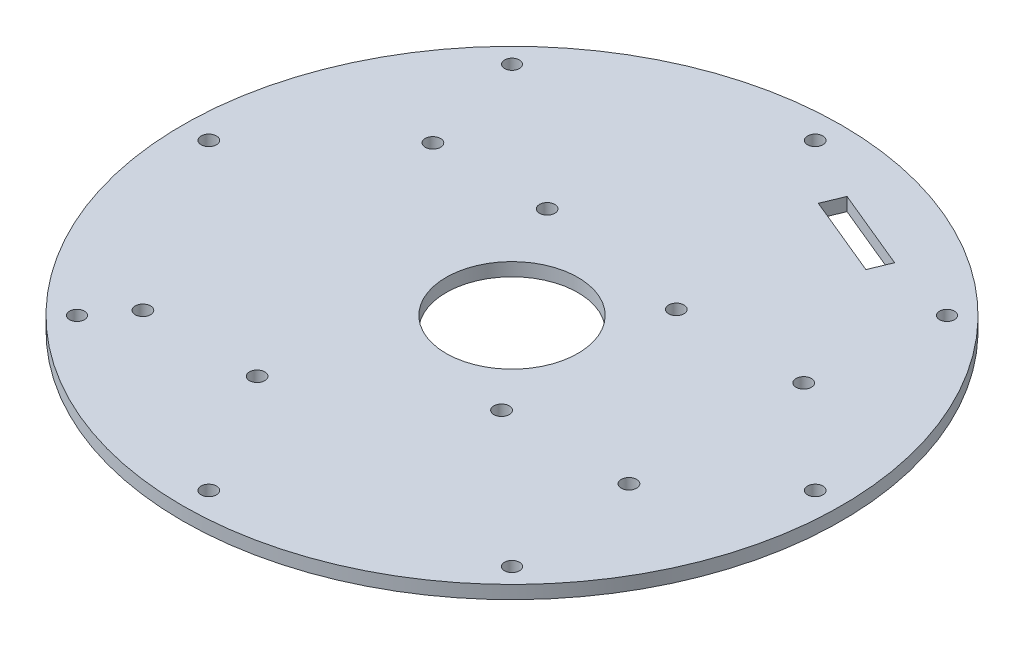
ISO-10303-21;
HEADER;
FILE_DESCRIPTION(('STEP AP214'),'2;1');
FILE_NAME('part.step','',(''),(''),'','','');
FILE_SCHEMA(('AUTOMOTIVE_DESIGN { 1 0 10303 214 1 1 1 1 }'));
ENDSEC;
DATA;
#1=APPLICATION_CONTEXT('core data for automotive mechanical design processes');
#2=APPLICATION_PROTOCOL_DEFINITION('international standard','automotive_design',2000,#1);
#3=PRODUCT_CONTEXT('',#1,'mechanical');
#4=PRODUCT('Part','Part','',(#3));
#5=PRODUCT_RELATED_PRODUCT_CATEGORY('part','',(#4));
#6=PRODUCT_DEFINITION_FORMATION('','',#4);
#7=PRODUCT_DEFINITION_CONTEXT('part definition',#1,'design');
#8=PRODUCT_DEFINITION('design','',#6,#7);
#9=PRODUCT_DEFINITION_SHAPE('','',#8);
#10=(LENGTH_UNIT() NAMED_UNIT(*) SI_UNIT(.MILLI.,.METRE.));
#11=(NAMED_UNIT(*) PLANE_ANGLE_UNIT() SI_UNIT($,.RADIAN.));
#12=(NAMED_UNIT(*) SI_UNIT($,.STERADIAN.) SOLID_ANGLE_UNIT());
#13=UNCERTAINTY_MEASURE_WITH_UNIT(LENGTH_MEASURE(1.E-05),#10,'distance_accuracy_value','');
#14=(GEOMETRIC_REPRESENTATION_CONTEXT(3) GLOBAL_UNCERTAINTY_ASSIGNED_CONTEXT((#13)) GLOBAL_UNIT_ASSIGNED_CONTEXT((#10,
#11,#12)) REPRESENTATION_CONTEXT('',''));
#15=CARTESIAN_POINT('',(0.,0.,0.));
#16=DIRECTION('',(0.,0.,1.));
#17=DIRECTION('',(1.,0.,0.));
#18=AXIS2_PLACEMENT_3D('',#15,#16,#17);
#19=CARTESIAN_POINT('',(0.,3.,0.));
#20=DIRECTION('',(0.,1.,0.));
#21=DIRECTION('',(0.,0.,1.));
#22=AXIS2_PLACEMENT_3D('',#19,#20,#21);
#23=PLANE('',#22);
#24=CARTESIAN_POINT('',(46.4944426533332,3.,19.8841311409812));
#25=DIRECTION('',(0.,1.,0.));
#26=DIRECTION('',(0.,0.,1.));
#27=AXIS2_PLACEMENT_3D('',#24,#25,#26);
#28=CIRCLE('',#27,1.75);
#29=CARTESIAN_POINT('',(46.4944426533332,3.,21.6341311409812));
#30=VERTEX_POINT('',#29);
#31=EDGE_CURVE('E134',#30,#30,#28,.T.);
#32=ORIENTED_EDGE('',*,*,#31,.F.);
#33=EDGE_LOOP('',(#32));
#34=FACE_BOUND('',#33,.T.);
#35=CARTESIAN_POINT('',(-43.,3.,41.));
#36=DIRECTION('',(0.,1.,0.));
#37=DIRECTION('',(0.,0.,1.));
#38=AXIS2_PLACEMENT_3D('',#35,#36,#37);
#39=CIRCLE('',#38,1.75);
#40=CARTESIAN_POINT('',(-43.,3.,42.75));
#41=VERTEX_POINT('',#40);
#42=EDGE_CURVE('E127',#41,#41,#39,.T.);
#43=ORIENTED_EDGE('',*,*,#42,.F.);
#44=EDGE_LOOP('',(#43));
#45=FACE_BOUND('',#44,.T.);
#46=CARTESIAN_POINT('',(-17.,3.,41.));
#47=DIRECTION('',(0.,1.,0.));
#48=DIRECTION('',(0.,0.,1.));
#49=AXIS2_PLACEMENT_3D('',#46,#47,#48);
#50=CIRCLE('',#49,1.75);
#51=CARTESIAN_POINT('',(-17.,3.,42.75));
#52=VERTEX_POINT('',#51);
#53=EDGE_CURVE('E146',#52,#52,#50,.T.);
#54=ORIENTED_EDGE('',*,*,#53,.F.);
#55=EDGE_LOOP('',(#54));
#56=FACE_BOUND('',#55,.T.);
#57=CARTESIAN_POINT('',(-17.,3.,-25.));
#58=DIRECTION('',(0.,1.,0.));
#59=DIRECTION('',(0.,0.,1.));
#60=AXIS2_PLACEMENT_3D('',#57,#58,#59);
#61=CIRCLE('',#60,1.75);
#62=CARTESIAN_POINT('',(-17.,3.,-23.25));
#63=VERTEX_POINT('',#62);
#64=EDGE_CURVE('E139',#63,#63,#61,.T.);
#65=ORIENTED_EDGE('',*,*,#64,.F.);
#66=EDGE_LOOP('',(#65));
#67=FACE_BOUND('',#66,.T.);
#68=DIRECTION('',(-0.923879532511288,0.,-0.382683432365086));
#69=VECTOR('',#68,1.);
#70=CARTESIAN_POINT('',(33.1565098479308,3.,-53.9156364583046));
#71=LINE('',#70,#69);
#72=CARTESIAN_POINT('',(33.1565098479308,3.,-53.9156364583046));
#73=VERTEX_POINT('',#72);
#74=CARTESIAN_POINT('',(14.678919197705,3.,-61.5693051056064));
#75=VERTEX_POINT('',#74);
#76=EDGE_CURVE('E83',#73,#75,#71,.T.);
#77=ORIENTED_EDGE('',*,*,#76,.F.);
#78=DIRECTION('',(0.382683432365087,0.,-0.923879532511288));
#79=VECTOR('',#78,1.);
#80=CARTESIAN_POINT('',(31.2430926861054,3.,-49.2962387957482));
#81=LINE('',#80,#79);
#82=CARTESIAN_POINT('',(31.2430926861054,3.,-49.2962387957482));
#83=VERTEX_POINT('',#82);
#84=EDGE_CURVE('E75',#83,#73,#81,.T.);
#85=ORIENTED_EDGE('',*,*,#84,.F.);
#86=DIRECTION('',(0.923879532511288,0.,0.382683432365086));
#87=VECTOR('',#86,1.);
#88=CARTESIAN_POINT('',(31.2430926861054,3.,-49.2962387957482));
#89=LINE('',#88,#87);
#90=CARTESIAN_POINT('',(12.7655020358796,3.,-56.9499074430499));
#91=VERTEX_POINT('',#90);
#92=EDGE_CURVE('E98',#91,#83,#89,.T.);
#93=ORIENTED_EDGE('',*,*,#92,.F.);
#94=DIRECTION('',(-0.382683432365086,0.,0.923879532511288));
#95=VECTOR('',#94,1.);
#96=CARTESIAN_POINT('',(12.7655020358796,3.,-56.9499074430499));
#97=LINE('',#96,#95);
#98=EDGE_CURVE('E96',#75,#91,#97,.T.);
#99=ORIENTED_EDGE('',*,*,#98,.F.);
#100=EDGE_LOOP('',(#77,#85,#93,#99));
#101=FACE_BOUND('',#100,.T.);
#102=CARTESIAN_POINT('',(17.5055573466668,3.,19.8841311409812));
#103=DIRECTION('',(0.,1.,0.));
#104=DIRECTION('',(0.,0.,1.));
#105=AXIS2_PLACEMENT_3D('',#102,#103,#104);
#106=CIRCLE('',#105,1.75);
#107=CARTESIAN_POINT('',(17.5055573466668,3.,21.6341311409812));
#108=VERTEX_POINT('',#107);
#109=EDGE_CURVE('E126',#108,#108,#106,.T.);
#110=ORIENTED_EDGE('',*,*,#109,.F.);
#111=EDGE_LOOP('',(#110));
#112=FACE_BOUND('',#111,.T.);
#113=CARTESIAN_POINT('',(46.4944426533332,3.,-19.8841311409812));
#114=DIRECTION('',(0.,1.,0.));
#115=DIRECTION('',(0.,0.,1.));
#116=AXIS2_PLACEMENT_3D('',#113,#114,#115);
#117=CIRCLE('',#116,1.75);
#118=CARTESIAN_POINT('',(46.4944426533332,3.,-18.1341311409812));
#119=VERTEX_POINT('',#118);
#120=EDGE_CURVE('E120',#119,#119,#117,.T.);
#121=ORIENTED_EDGE('',*,*,#120,.F.);
#122=EDGE_LOOP('',(#121));
#123=FACE_BOUND('',#122,.T.);
#124=CARTESIAN_POINT('',(17.5055573466668,3.,-19.8841311409812));
#125=DIRECTION('',(0.,1.,0.));
#126=DIRECTION('',(0.,0.,1.));
#127=AXIS2_PLACEMENT_3D('',#124,#125,#126);
#128=CIRCLE('',#127,1.74999999999999);
#129=CARTESIAN_POINT('',(17.5055573466668,3.,-18.1341311409812));
#130=VERTEX_POINT('',#129);
#131=EDGE_CURVE('E113',#130,#130,#128,.T.);
#132=ORIENTED_EDGE('',*,*,#131,.F.);
#133=EDGE_LOOP('',(#132));
#134=FACE_BOUND('',#133,.T.);
#135=CARTESIAN_POINT('',(-43.,3.,-25.));
#136=DIRECTION('',(0.,1.,0.));
#137=DIRECTION('',(0.,0.,1.));
#138=AXIS2_PLACEMENT_3D('',#135,#136,#137);
#139=CIRCLE('',#138,1.75);
#140=CARTESIAN_POINT('',(-43.,3.,-23.25));
#141=VERTEX_POINT('',#140);
#142=EDGE_CURVE('E151',#141,#141,#139,.T.);
#143=ORIENTED_EDGE('',*,*,#142,.F.);
#144=EDGE_LOOP('',(#143));
#145=FACE_BOUND('',#144,.T.);
#146=CARTESIAN_POINT('',(0.,3.,-69.));
#147=DIRECTION('',(0.,1.,0.));
#148=DIRECTION('',(0.,0.,1.));
#149=AXIS2_PLACEMENT_3D('',#146,#147,#148);
#150=CIRCLE('',#149,1.75);
#151=CARTESIAN_POINT('',(0.,3.,-67.25));
#152=VERTEX_POINT('',#151);
#153=EDGE_CURVE('E157',#152,#152,#150,.T.);
#154=ORIENTED_EDGE('',*,*,#153,.F.);
#155=EDGE_LOOP('',(#154));
#156=FACE_BOUND('',#155,.T.);
#157=CARTESIAN_POINT('',(69.,3.,0.));
#158=DIRECTION('',(0.,1.,0.));
#159=DIRECTION('',(0.,0.,1.));
#160=AXIS2_PLACEMENT_3D('',#157,#158,#159);
#161=CIRCLE('',#160,1.75);
#162=CARTESIAN_POINT('',(69.,3.,1.75));
#163=VERTEX_POINT('',#162);
#164=EDGE_CURVE('E164',#163,#163,#161,.T.);
#165=ORIENTED_EDGE('',*,*,#164,.F.);
#166=EDGE_LOOP('',(#165));
#167=FACE_BOUND('',#166,.T.);
#168=CARTESIAN_POINT('',(0.,3.,69.));
#169=DIRECTION('',(0.,1.,0.));
#170=DIRECTION('',(0.,0.,1.));
#171=AXIS2_PLACEMENT_3D('',#168,#169,#170);
#172=CIRCLE('',#171,1.75);
#173=CARTESIAN_POINT('',(0.,3.,70.75));
#174=VERTEX_POINT('',#173);
#175=EDGE_CURVE('E170',#174,#174,#172,.T.);
#176=ORIENTED_EDGE('',*,*,#175,.F.);
#177=EDGE_LOOP('',(#176));
#178=FACE_BOUND('',#177,.T.);
#179=CARTESIAN_POINT('',(-69.,3.,0.));
#180=DIRECTION('',(0.,1.,0.));
#181=DIRECTION('',(0.,0.,1.));
#182=AXIS2_PLACEMENT_3D('',#179,#180,#181);
#183=CIRCLE('',#182,1.75);
#184=CARTESIAN_POINT('',(-69.,3.,1.75));
#185=VERTEX_POINT('',#184);
#186=EDGE_CURVE('E176',#185,#185,#183,.T.);
#187=ORIENTED_EDGE('',*,*,#186,.F.);
#188=EDGE_LOOP('',(#187));
#189=FACE_BOUND('',#188,.T.);
#190=CARTESIAN_POINT('',(49.4974746830584,3.,49.4974746830582));
#191=DIRECTION('',(0.,1.,0.));
#192=DIRECTION('',(0.,0.,1.));
#193=AXIS2_PLACEMENT_3D('',#190,#191,#192);
#194=CIRCLE('',#193,1.7);
#195=CARTESIAN_POINT('',(49.4974746830584,3.,51.1974746830582));
#196=VERTEX_POINT('',#195);
#197=EDGE_CURVE('E187',#196,#196,#194,.T.);
#198=ORIENTED_EDGE('',*,*,#197,.F.);
#199=EDGE_LOOP('',(#198));
#200=FACE_BOUND('',#199,.T.);
#201=CARTESIAN_POINT('',(-49.4974746830584,3.,-49.4974746830582));
#202=DIRECTION('',(0.,1.,0.));
#203=DIRECTION('',(0.,0.,1.));
#204=AXIS2_PLACEMENT_3D('',#201,#202,#203);
#205=CIRCLE('',#204,1.7);
#206=CARTESIAN_POINT('',(-49.4974746830584,3.,-47.7974746830582));
#207=VERTEX_POINT('',#206);
#208=EDGE_CURVE('E199',#207,#207,#205,.T.);
#209=ORIENTED_EDGE('',*,*,#208,.F.);
#210=EDGE_LOOP('',(#209));
#211=FACE_BOUND('',#210,.T.);
#212=CARTESIAN_POINT('',(0.,3.,0.));
#213=DIRECTION('',(0.,1.,0.));
#214=DIRECTION('',(0.,0.,1.));
#215=AXIS2_PLACEMENT_3D('',#212,#213,#214);
#216=CIRCLE('',#215,75.);
#217=CARTESIAN_POINT('',(0.,3.,75.));
#218=VERTEX_POINT('',#217);
#219=EDGE_CURVE('E11',#218,#218,#216,.T.);
#220=ORIENTED_EDGE('',*,*,#219,.T.);
#221=EDGE_LOOP('',(#220));
#222=FACE_BOUND('',#221,.T.);
#223=CARTESIAN_POINT('',(49.4974746830582,3.,-49.4974746830584));
#224=DIRECTION('',(0.,1.,0.));
#225=DIRECTION('',(0.,0.,1.));
#226=AXIS2_PLACEMENT_3D('',#223,#224,#225);
#227=CIRCLE('',#226,1.7);
#228=CARTESIAN_POINT('',(49.4974746830582,3.,-47.7974746830584));
#229=VERTEX_POINT('',#228);
#230=EDGE_CURVE('E205',#229,#229,#227,.T.);
#231=ORIENTED_EDGE('',*,*,#230,.F.);
#232=EDGE_LOOP('',(#231));
#233=FACE_BOUND('',#232,.T.);
#234=CARTESIAN_POINT('',(-49.4974746830582,3.,49.4974746830584));
#235=DIRECTION('',(0.,1.,0.));
#236=DIRECTION('',(0.,0.,1.));
#237=AXIS2_PLACEMENT_3D('',#234,#235,#236);
#238=CIRCLE('',#237,1.7);
#239=CARTESIAN_POINT('',(-49.4974746830582,3.,51.1974746830584));
#240=VERTEX_POINT('',#239);
#241=EDGE_CURVE('E193',#240,#240,#238,.T.);
#242=ORIENTED_EDGE('',*,*,#241,.F.);
#243=EDGE_LOOP('',(#242));
#244=FACE_BOUND('',#243,.T.);
#245=CARTESIAN_POINT('',(0.,3.,0.));
#246=DIRECTION('',(0.,1.,0.));
#247=DIRECTION('',(0.,0.,1.));
#248=AXIS2_PLACEMENT_3D('',#245,#246,#247);
#249=CIRCLE('',#248,15.);
#250=CARTESIAN_POINT('',(0.,3.,15.));
#251=VERTEX_POINT('',#250);
#252=EDGE_CURVE('E181',#251,#251,#249,.T.);
#253=ORIENTED_EDGE('',*,*,#252,.F.);
#254=EDGE_LOOP('',(#253));
#255=FACE_BOUND('',#254,.T.);
#256=ADVANCED_FACE('F34',(#34,#45,#56,#67,#101,#112,#123,#134,#145,#156,#167,#178,#189,#200,
#211,#222,#233,#244,#255),#23,.T.);
#257=CARTESIAN_POINT('',(0.,0.,0.));
#258=DIRECTION('',(0.,1.,0.));
#259=DIRECTION('',(0.,0.,1.));
#260=AXIS2_PLACEMENT_3D('',#257,#258,#259);
#261=PLANE('',#260);
#262=CARTESIAN_POINT('',(46.4944426533332,0.,19.8841311409812));
#263=DIRECTION('',(0.,1.,0.));
#264=DIRECTION('',(0.,0.,1.));
#265=AXIS2_PLACEMENT_3D('',#262,#263,#264);
#266=CIRCLE('',#265,1.75);
#267=CARTESIAN_POINT('',(46.4944426533332,0.,21.6341311409812));
#268=VERTEX_POINT('',#267);
#269=EDGE_CURVE('E116',#268,#268,#266,.T.);
#270=ORIENTED_EDGE('',*,*,#269,.T.);
#271=EDGE_LOOP('',(#270));
#272=FACE_BOUND('',#271,.T.);
#273=CARTESIAN_POINT('',(-43.,0.,41.));
#274=DIRECTION('',(0.,1.,0.));
#275=DIRECTION('',(0.,0.,1.));
#276=AXIS2_PLACEMENT_3D('',#273,#274,#275);
#277=CIRCLE('',#276,1.75);
#278=CARTESIAN_POINT('',(-43.,0.,42.75));
#279=VERTEX_POINT('',#278);
#280=EDGE_CURVE('E131',#279,#279,#277,.T.);
#281=ORIENTED_EDGE('',*,*,#280,.T.);
#282=EDGE_LOOP('',(#281));
#283=FACE_BOUND('',#282,.T.);
#284=CARTESIAN_POINT('',(-17.,0.,41.));
#285=DIRECTION('',(0.,1.,0.));
#286=DIRECTION('',(0.,0.,1.));
#287=AXIS2_PLACEMENT_3D('',#284,#285,#286);
#288=CIRCLE('',#287,1.75);
#289=CARTESIAN_POINT('',(-17.,0.,42.75));
#290=VERTEX_POINT('',#289);
#291=EDGE_CURVE('E130',#290,#290,#288,.T.);
#292=ORIENTED_EDGE('',*,*,#291,.T.);
#293=EDGE_LOOP('',(#292));
#294=FACE_BOUND('',#293,.T.);
#295=CARTESIAN_POINT('',(-17.,0.,-25.));
#296=DIRECTION('',(0.,1.,0.));
#297=DIRECTION('',(0.,0.,1.));
#298=AXIS2_PLACEMENT_3D('',#295,#296,#297);
#299=CIRCLE('',#298,1.75);
#300=CARTESIAN_POINT('',(-17.,0.,-23.25));
#301=VERTEX_POINT('',#300);
#302=EDGE_CURVE('E143',#301,#301,#299,.T.);
#303=ORIENTED_EDGE('',*,*,#302,.T.);
#304=EDGE_LOOP('',(#303));
#305=FACE_BOUND('',#304,.T.);
#306=DIRECTION('',(0.382683432365087,0.,-0.923879532511288));
#307=VECTOR('',#306,1.);
#308=CARTESIAN_POINT('',(31.2430926861054,0.,-49.2962387957482));
#309=LINE('',#308,#307);
#310=CARTESIAN_POINT('',(31.2430926861054,0.,-49.2962387957482));
#311=VERTEX_POINT('',#310);
#312=CARTESIAN_POINT('',(33.1565098479308,0.,-53.9156364583046));
#313=VERTEX_POINT('',#312);
#314=EDGE_CURVE('E57',#311,#313,#309,.T.);
#315=ORIENTED_EDGE('',*,*,#314,.T.);
#316=DIRECTION('',(-0.923879532511288,0.,-0.382683432365086));
#317=VECTOR('',#316,1.);
#318=CARTESIAN_POINT('',(33.1565098479308,0.,-53.9156364583046));
#319=LINE('',#318,#317);
#320=CARTESIAN_POINT('',(14.678919197705,0.,-61.5693051056064));
#321=VERTEX_POINT('',#320);
#322=EDGE_CURVE('E90',#313,#321,#319,.T.);
#323=ORIENTED_EDGE('',*,*,#322,.T.);
#324=DIRECTION('',(-0.382683432365086,0.,0.923879532511288));
#325=VECTOR('',#324,1.);
#326=CARTESIAN_POINT('',(12.7655020358796,0.,-56.9499074430499));
#327=LINE('',#326,#325);
#328=CARTESIAN_POINT('',(12.7655020358796,0.,-56.9499074430499));
#329=VERTEX_POINT('',#328);
#330=EDGE_CURVE('E105',#321,#329,#327,.T.);
#331=ORIENTED_EDGE('',*,*,#330,.T.);
#332=DIRECTION('',(0.923879532511288,0.,0.382683432365086));
#333=VECTOR('',#332,1.);
#334=CARTESIAN_POINT('',(31.2430926861054,0.,-49.2962387957482));
#335=LINE('',#334,#333);
#336=EDGE_CURVE('E84',#329,#311,#335,.T.);
#337=ORIENTED_EDGE('',*,*,#336,.T.);
#338=EDGE_LOOP('',(#315,#323,#331,#337));
#339=FACE_BOUND('',#338,.T.);
#340=CARTESIAN_POINT('',(17.5055573466668,0.,19.8841311409812));
#341=DIRECTION('',(0.,1.,0.));
#342=DIRECTION('',(0.,0.,1.));
#343=AXIS2_PLACEMENT_3D('',#340,#341,#342);
#344=CIRCLE('',#343,1.75);
#345=CARTESIAN_POINT('',(17.5055573466668,0.,21.6341311409812));
#346=VERTEX_POINT('',#345);
#347=EDGE_CURVE('E91',#346,#346,#344,.T.);
#348=ORIENTED_EDGE('',*,*,#347,.T.);
#349=EDGE_LOOP('',(#348));
#350=FACE_BOUND('',#349,.T.);
#351=CARTESIAN_POINT('',(46.4944426533332,0.,-19.8841311409812));
#352=DIRECTION('',(0.,1.,0.));
#353=DIRECTION('',(0.,0.,1.));
#354=AXIS2_PLACEMENT_3D('',#351,#352,#353);
#355=CIRCLE('',#354,1.75);
#356=CARTESIAN_POINT('',(46.4944426533332,0.,-18.1341311409812));
#357=VERTEX_POINT('',#356);
#358=EDGE_CURVE('E123',#357,#357,#355,.T.);
#359=ORIENTED_EDGE('',*,*,#358,.T.);
#360=EDGE_LOOP('',(#359));
#361=FACE_BOUND('',#360,.T.);
#362=CARTESIAN_POINT('',(17.5055573466668,0.,-19.8841311409812));
#363=DIRECTION('',(0.,1.,0.));
#364=DIRECTION('',(0.,0.,1.));
#365=AXIS2_PLACEMENT_3D('',#362,#363,#364);
#366=CIRCLE('',#365,1.74999999999999);
#367=CARTESIAN_POINT('',(17.5055573466668,0.,-18.1341311409812));
#368=VERTEX_POINT('',#367);
#369=EDGE_CURVE('E117',#368,#368,#366,.T.);
#370=ORIENTED_EDGE('',*,*,#369,.T.);
#371=EDGE_LOOP('',(#370));
#372=FACE_BOUND('',#371,.T.);
#373=CARTESIAN_POINT('',(-43.,0.,-25.));
#374=DIRECTION('',(0.,1.,0.));
#375=DIRECTION('',(0.,0.,1.));
#376=AXIS2_PLACEMENT_3D('',#373,#374,#375);
#377=CIRCLE('',#376,1.75);
#378=CARTESIAN_POINT('',(-43.,0.,-23.25));
#379=VERTEX_POINT('',#378);
#380=EDGE_CURVE('E142',#379,#379,#377,.T.);
#381=ORIENTED_EDGE('',*,*,#380,.T.);
#382=EDGE_LOOP('',(#381));
#383=FACE_BOUND('',#382,.T.);
#384=CARTESIAN_POINT('',(0.,0.,-69.));
#385=DIRECTION('',(0.,1.,0.));
#386=DIRECTION('',(0.,0.,1.));
#387=AXIS2_PLACEMENT_3D('',#384,#385,#386);
#388=CIRCLE('',#387,1.75);
#389=CARTESIAN_POINT('',(0.,0.,-67.25));
#390=VERTEX_POINT('',#389);
#391=EDGE_CURVE('E161',#390,#390,#388,.T.);
#392=ORIENTED_EDGE('',*,*,#391,.T.);
#393=EDGE_LOOP('',(#392));
#394=FACE_BOUND('',#393,.T.);
#395=CARTESIAN_POINT('',(69.,0.,0.));
#396=DIRECTION('',(0.,1.,0.));
#397=DIRECTION('',(0.,0.,1.));
#398=AXIS2_PLACEMENT_3D('',#395,#396,#397);
#399=CIRCLE('',#398,1.75);
#400=CARTESIAN_POINT('',(69.,0.,1.75));
#401=VERTEX_POINT('',#400);
#402=EDGE_CURVE('E167',#401,#401,#399,.T.);
#403=ORIENTED_EDGE('',*,*,#402,.T.);
#404=EDGE_LOOP('',(#403));
#405=FACE_BOUND('',#404,.T.);
#406=CARTESIAN_POINT('',(0.,0.,69.));
#407=DIRECTION('',(0.,1.,0.));
#408=DIRECTION('',(0.,0.,1.));
#409=AXIS2_PLACEMENT_3D('',#406,#407,#408);
#410=CIRCLE('',#409,1.75);
#411=CARTESIAN_POINT('',(0.,0.,70.75));
#412=VERTEX_POINT('',#411);
#413=EDGE_CURVE('E173',#412,#412,#410,.T.);
#414=ORIENTED_EDGE('',*,*,#413,.T.);
#415=EDGE_LOOP('',(#414));
#416=FACE_BOUND('',#415,.T.);
#417=CARTESIAN_POINT('',(-69.,0.,0.));
#418=DIRECTION('',(0.,1.,0.));
#419=DIRECTION('',(0.,0.,1.));
#420=AXIS2_PLACEMENT_3D('',#417,#418,#419);
#421=CIRCLE('',#420,1.75);
#422=CARTESIAN_POINT('',(-69.,0.,1.75));
#423=VERTEX_POINT('',#422);
#424=EDGE_CURVE('E154',#423,#423,#421,.T.);
#425=ORIENTED_EDGE('',*,*,#424,.T.);
#426=EDGE_LOOP('',(#425));
#427=FACE_BOUND('',#426,.T.);
#428=CARTESIAN_POINT('',(0.,0.,0.));
#429=DIRECTION('',(0.,1.,0.));
#430=DIRECTION('',(0.,0.,1.));
#431=AXIS2_PLACEMENT_3D('',#428,#429,#430);
#432=CIRCLE('',#431,75.);
#433=CARTESIAN_POINT('',(0.,0.,75.));
#434=VERTEX_POINT('',#433);
#435=EDGE_CURVE('E38',#434,#434,#432,.T.);
#436=ORIENTED_EDGE('',*,*,#435,.F.);
#437=EDGE_LOOP('',(#436));
#438=FACE_BOUND('',#437,.T.);
#439=CARTESIAN_POINT('',(49.4974746830582,0.,-49.4974746830584));
#440=DIRECTION('',(0.,1.,0.));
#441=DIRECTION('',(0.,0.,1.));
#442=AXIS2_PLACEMENT_3D('',#439,#440,#441);
#443=CIRCLE('',#442,1.7);
#444=CARTESIAN_POINT('',(49.4974746830582,0.,-47.7974746830584));
#445=VERTEX_POINT('',#444);
#446=EDGE_CURVE('E202',#445,#445,#443,.T.);
#447=ORIENTED_EDGE('',*,*,#446,.T.);
#448=EDGE_LOOP('',(#447));
#449=FACE_BOUND('',#448,.T.);
#450=CARTESIAN_POINT('',(-49.4974746830584,0.,-49.4974746830582));
#451=DIRECTION('',(0.,1.,0.));
#452=DIRECTION('',(0.,0.,1.));
#453=AXIS2_PLACEMENT_3D('',#450,#451,#452);
#454=CIRCLE('',#453,1.7);
#455=CARTESIAN_POINT('',(-49.4974746830584,0.,-47.7974746830582));
#456=VERTEX_POINT('',#455);
#457=EDGE_CURVE('E196',#456,#456,#454,.T.);
#458=ORIENTED_EDGE('',*,*,#457,.T.);
#459=EDGE_LOOP('',(#458));
#460=FACE_BOUND('',#459,.T.);
#461=CARTESIAN_POINT('',(-49.4974746830582,0.,49.4974746830584));
#462=DIRECTION('',(0.,1.,0.));
#463=DIRECTION('',(0.,0.,1.));
#464=AXIS2_PLACEMENT_3D('',#461,#462,#463);
#465=CIRCLE('',#464,1.7);
#466=CARTESIAN_POINT('',(-49.4974746830582,0.,51.1974746830584));
#467=VERTEX_POINT('',#466);
#468=EDGE_CURVE('E190',#467,#467,#465,.T.);
#469=ORIENTED_EDGE('',*,*,#468,.T.);
#470=EDGE_LOOP('',(#469));
#471=FACE_BOUND('',#470,.T.);
#472=CARTESIAN_POINT('',(49.4974746830584,0.,49.4974746830582));
#473=DIRECTION('',(0.,1.,0.));
#474=DIRECTION('',(0.,0.,1.));
#475=AXIS2_PLACEMENT_3D('',#472,#473,#474);
#476=CIRCLE('',#475,1.7);
#477=CARTESIAN_POINT('',(49.4974746830584,0.,51.1974746830582));
#478=VERTEX_POINT('',#477);
#479=EDGE_CURVE('E184',#478,#478,#476,.T.);
#480=ORIENTED_EDGE('',*,*,#479,.T.);
#481=EDGE_LOOP('',(#480));
#482=FACE_BOUND('',#481,.T.);
#483=CARTESIAN_POINT('',(0.,0.,0.));
#484=DIRECTION('',(0.,1.,0.));
#485=DIRECTION('',(0.,0.,1.));
#486=AXIS2_PLACEMENT_3D('',#483,#484,#485);
#487=CIRCLE('',#486,15.);
#488=CARTESIAN_POINT('',(0.,0.,15.));
#489=VERTEX_POINT('',#488);
#490=EDGE_CURVE('E160',#489,#489,#487,.T.);
#491=ORIENTED_EDGE('',*,*,#490,.T.);
#492=EDGE_LOOP('',(#491));
#493=FACE_BOUND('',#492,.T.);
#494=ADVANCED_FACE('F211',(#272,#283,#294,#305,#339,#350,#361,#372,#383,#394,#405,#416,#427,
#438,#449,#460,#471,#482,#493),#261,.F.);
#495=CARTESIAN_POINT('',(0.,3.,0.));
#496=DIRECTION('',(0.,-1.,0.));
#497=DIRECTION('',(0.,0.,-1.));
#498=AXIS2_PLACEMENT_3D('',#495,#496,#497);
#499=CYLINDRICAL_SURFACE('',#498,75.);
#500=ORIENTED_EDGE('',*,*,#219,.F.);
#501=EDGE_LOOP('',(#500));
#502=FACE_BOUND('',#501,.T.);
#503=ORIENTED_EDGE('',*,*,#435,.T.);
#504=EDGE_LOOP('',(#503));
#505=FACE_BOUND('',#504,.T.);
#506=ADVANCED_FACE('F36',(#502,#505),#499,.T.);
#507=CARTESIAN_POINT('',(49.4974746830582,3.,-49.4974746830584));
#508=DIRECTION('',(0.,-1.,0.));
#509=DIRECTION('',(0.,0.,-1.));
#510=AXIS2_PLACEMENT_3D('',#507,#508,#509);
#511=CYLINDRICAL_SURFACE('',#510,1.7);
#512=ORIENTED_EDGE('',*,*,#230,.T.);
#513=EDGE_LOOP('',(#512));
#514=FACE_BOUND('',#513,.T.);
#515=ORIENTED_EDGE('',*,*,#446,.F.);
#516=EDGE_LOOP('',(#515));
#517=FACE_BOUND('',#516,.T.);
#518=ADVANCED_FACE('F214',(#514,#517),#511,.F.);
#519=CARTESIAN_POINT('',(-49.4974746830584,3.,-49.4974746830582));
#520=DIRECTION('',(0.,-1.,0.));
#521=DIRECTION('',(0.,0.,-1.));
#522=AXIS2_PLACEMENT_3D('',#519,#520,#521);
#523=CYLINDRICAL_SURFACE('',#522,1.7);
#524=ORIENTED_EDGE('',*,*,#208,.T.);
#525=EDGE_LOOP('',(#524));
#526=FACE_BOUND('',#525,.T.);
#527=ORIENTED_EDGE('',*,*,#457,.F.);
#528=EDGE_LOOP('',(#527));
#529=FACE_BOUND('',#528,.T.);
#530=ADVANCED_FACE('F216',(#526,#529),#523,.F.);
#531=CARTESIAN_POINT('',(-49.4974746830582,3.,49.4974746830584));
#532=DIRECTION('',(0.,-1.,0.));
#533=DIRECTION('',(0.,0.,-1.));
#534=AXIS2_PLACEMENT_3D('',#531,#532,#533);
#535=CYLINDRICAL_SURFACE('',#534,1.7);
#536=ORIENTED_EDGE('',*,*,#241,.T.);
#537=EDGE_LOOP('',(#536));
#538=FACE_BOUND('',#537,.T.);
#539=ORIENTED_EDGE('',*,*,#468,.F.);
#540=EDGE_LOOP('',(#539));
#541=FACE_BOUND('',#540,.T.);
#542=ADVANCED_FACE('F223',(#538,#541),#535,.F.);
#543=CARTESIAN_POINT('',(49.4974746830584,3.,49.4974746830582));
#544=DIRECTION('',(0.,-1.,0.));
#545=DIRECTION('',(0.,0.,-1.));
#546=AXIS2_PLACEMENT_3D('',#543,#544,#545);
#547=CYLINDRICAL_SURFACE('',#546,1.7);
#548=ORIENTED_EDGE('',*,*,#197,.T.);
#549=EDGE_LOOP('',(#548));
#550=FACE_BOUND('',#549,.T.);
#551=ORIENTED_EDGE('',*,*,#479,.F.);
#552=EDGE_LOOP('',(#551));
#553=FACE_BOUND('',#552,.T.);
#554=ADVANCED_FACE('F286',(#550,#553),#547,.F.);
#555=CARTESIAN_POINT('',(0.,3.,0.));
#556=DIRECTION('',(0.,-1.,0.));
#557=DIRECTION('',(0.,0.,-1.));
#558=AXIS2_PLACEMENT_3D('',#555,#556,#557);
#559=CYLINDRICAL_SURFACE('',#558,15.);
#560=ORIENTED_EDGE('',*,*,#252,.T.);
#561=EDGE_LOOP('',(#560));
#562=FACE_BOUND('',#561,.T.);
#563=ORIENTED_EDGE('',*,*,#490,.F.);
#564=EDGE_LOOP('',(#563));
#565=FACE_BOUND('',#564,.T.);
#566=ADVANCED_FACE('F276',(#562,#565),#559,.F.);
#567=CARTESIAN_POINT('',(-69.,3.,0.));
#568=DIRECTION('',(0.,-1.,0.));
#569=DIRECTION('',(0.,0.,-1.));
#570=AXIS2_PLACEMENT_3D('',#567,#568,#569);
#571=CYLINDRICAL_SURFACE('',#570,1.75);
#572=ORIENTED_EDGE('',*,*,#186,.T.);
#573=EDGE_LOOP('',(#572));
#574=FACE_BOUND('',#573,.T.);
#575=ORIENTED_EDGE('',*,*,#424,.F.);
#576=EDGE_LOOP('',(#575));
#577=FACE_BOUND('',#576,.T.);
#578=ADVANCED_FACE('F273',(#574,#577),#571,.F.);
#579=CARTESIAN_POINT('',(0.,3.,69.));
#580=DIRECTION('',(0.,-1.,0.));
#581=DIRECTION('',(0.,0.,-1.));
#582=AXIS2_PLACEMENT_3D('',#579,#580,#581);
#583=CYLINDRICAL_SURFACE('',#582,1.75);
#584=ORIENTED_EDGE('',*,*,#175,.T.);
#585=EDGE_LOOP('',(#584));
#586=FACE_BOUND('',#585,.T.);
#587=ORIENTED_EDGE('',*,*,#413,.F.);
#588=EDGE_LOOP('',(#587));
#589=FACE_BOUND('',#588,.T.);
#590=ADVANCED_FACE('F275',(#586,#589),#583,.F.);
#591=CARTESIAN_POINT('',(69.,3.,0.));
#592=DIRECTION('',(0.,-1.,0.));
#593=DIRECTION('',(0.,0.,-1.));
#594=AXIS2_PLACEMENT_3D('',#591,#592,#593);
#595=CYLINDRICAL_SURFACE('',#594,1.75);
#596=ORIENTED_EDGE('',*,*,#164,.T.);
#597=EDGE_LOOP('',(#596));
#598=FACE_BOUND('',#597,.T.);
#599=ORIENTED_EDGE('',*,*,#402,.F.);
#600=EDGE_LOOP('',(#599));
#601=FACE_BOUND('',#600,.T.);
#602=ADVANCED_FACE('F283',(#598,#601),#595,.F.);
#603=CARTESIAN_POINT('',(0.,3.,-69.));
#604=DIRECTION('',(0.,-1.,0.));
#605=DIRECTION('',(0.,0.,-1.));
#606=AXIS2_PLACEMENT_3D('',#603,#604,#605);
#607=CYLINDRICAL_SURFACE('',#606,1.75);
#608=ORIENTED_EDGE('',*,*,#153,.T.);
#609=EDGE_LOOP('',(#608));
#610=FACE_BOUND('',#609,.T.);
#611=ORIENTED_EDGE('',*,*,#391,.F.);
#612=EDGE_LOOP('',(#611));
#613=FACE_BOUND('',#612,.T.);
#614=ADVANCED_FACE('F340',(#610,#613),#607,.F.);
#615=CARTESIAN_POINT('',(-43.,3.,-25.));
#616=DIRECTION('',(0.,-1.,0.));
#617=DIRECTION('',(0.,0.,-1.));
#618=AXIS2_PLACEMENT_3D('',#615,#616,#617);
#619=CYLINDRICAL_SURFACE('',#618,1.75);
#620=ORIENTED_EDGE('',*,*,#142,.T.);
#621=EDGE_LOOP('',(#620));
#622=FACE_BOUND('',#621,.T.);
#623=ORIENTED_EDGE('',*,*,#380,.F.);
#624=EDGE_LOOP('',(#623));
#625=FACE_BOUND('',#624,.T.);
#626=ADVANCED_FACE('F348',(#622,#625),#619,.F.);
#627=CARTESIAN_POINT('',(17.5055573466668,3.,-19.8841311409812));
#628=DIRECTION('',(0.,-1.,0.));
#629=DIRECTION('',(0.,0.,-1.));
#630=AXIS2_PLACEMENT_3D('',#627,#628,#629);
#631=CYLINDRICAL_SURFACE('',#630,1.74999999999999);
#632=ORIENTED_EDGE('',*,*,#131,.T.);
#633=EDGE_LOOP('',(#632));
#634=FACE_BOUND('',#633,.T.);
#635=ORIENTED_EDGE('',*,*,#369,.F.);
#636=EDGE_LOOP('',(#635));
#637=FACE_BOUND('',#636,.T.);
#638=ADVANCED_FACE('F370',(#634,#637),#631,.F.);
#639=CARTESIAN_POINT('',(46.4944426533332,3.,-19.8841311409812));
#640=DIRECTION('',(0.,-1.,0.));
#641=DIRECTION('',(0.,0.,-1.));
#642=AXIS2_PLACEMENT_3D('',#639,#640,#641);
#643=CYLINDRICAL_SURFACE('',#642,1.75);
#644=ORIENTED_EDGE('',*,*,#120,.T.);
#645=EDGE_LOOP('',(#644));
#646=FACE_BOUND('',#645,.T.);
#647=ORIENTED_EDGE('',*,*,#358,.F.);
#648=EDGE_LOOP('',(#647));
#649=FACE_BOUND('',#648,.T.);
#650=ADVANCED_FACE('F380',(#646,#649),#643,.F.);
#651=CARTESIAN_POINT('',(17.5055573466668,3.,19.8841311409812));
#652=DIRECTION('',(0.,-1.,0.));
#653=DIRECTION('',(0.,0.,-1.));
#654=AXIS2_PLACEMENT_3D('',#651,#652,#653);
#655=CYLINDRICAL_SURFACE('',#654,1.75);
#656=ORIENTED_EDGE('',*,*,#109,.T.);
#657=EDGE_LOOP('',(#656));
#658=FACE_BOUND('',#657,.T.);
#659=ORIENTED_EDGE('',*,*,#347,.F.);
#660=EDGE_LOOP('',(#659));
#661=FACE_BOUND('',#660,.T.);
#662=ADVANCED_FACE('F390',(#658,#661),#655,.F.);
#663=CARTESIAN_POINT('',(31.2430926861054,3.,-49.2962387957482));
#664=DIRECTION('',(-0.923879532511288,0.,-0.382683432365087));
#665=DIRECTION('',(-0.382683432365087,0.,0.923879532511288));
#666=AXIS2_PLACEMENT_3D('',#663,#664,#665);
#667=PLANE('',#666);
#668=ORIENTED_EDGE('',*,*,#314,.F.);
#669=DIRECTION('',(0.,-1.,0.));
#670=VECTOR('',#669,1.);
#671=CARTESIAN_POINT('',(31.2430926861054,3.,-49.2962387957482));
#672=LINE('',#671,#670);
#673=EDGE_CURVE('E79',#83,#311,#672,.T.);
#674=ORIENTED_EDGE('',*,*,#673,.F.);
#675=ORIENTED_EDGE('',*,*,#84,.T.);
#676=DIRECTION('',(0.,-1.,0.));
#677=VECTOR('',#676,1.);
#678=CARTESIAN_POINT('',(33.1565098479308,3.,-53.9156364583046));
#679=LINE('',#678,#677);
#680=EDGE_CURVE('E78',#73,#313,#679,.T.);
#681=ORIENTED_EDGE('',*,*,#680,.T.);
#682=EDGE_LOOP('',(#668,#674,#675,#681));
#683=FACE_BOUND('',#682,.T.);
#684=ADVANCED_FACE('F77',(#683),#667,.T.);
#685=CARTESIAN_POINT('',(33.1565098479308,3.,-53.9156364583046));
#686=DIRECTION('',(-0.382683432365086,0.,0.923879532511288));
#687=DIRECTION('',(0.923879532511288,0.,0.382683432365086));
#688=AXIS2_PLACEMENT_3D('',#685,#686,#687);
#689=PLANE('',#688);
#690=ORIENTED_EDGE('',*,*,#322,.F.);
#691=ORIENTED_EDGE('',*,*,#680,.F.);
#692=ORIENTED_EDGE('',*,*,#76,.T.);
#693=DIRECTION('',(0.,-1.,0.));
#694=VECTOR('',#693,1.);
#695=CARTESIAN_POINT('',(14.678919197705,3.,-61.5693051056064));
#696=LINE('',#695,#694);
#697=EDGE_CURVE('E92',#75,#321,#696,.T.);
#698=ORIENTED_EDGE('',*,*,#697,.T.);
#699=EDGE_LOOP('',(#690,#691,#692,#698));
#700=FACE_BOUND('',#699,.T.);
#701=ADVANCED_FACE('F87',(#700),#689,.T.);
#702=CARTESIAN_POINT('',(12.7655020358796,3.,-56.9499074430499));
#703=DIRECTION('',(0.923879532511288,0.,0.382683432365086));
#704=DIRECTION('',(0.382683432365086,0.,-0.923879532511288));
#705=AXIS2_PLACEMENT_3D('',#702,#703,#704);
#706=PLANE('',#705);
#707=ORIENTED_EDGE('',*,*,#330,.F.);
#708=ORIENTED_EDGE('',*,*,#697,.F.);
#709=ORIENTED_EDGE('',*,*,#98,.T.);
#710=DIRECTION('',(0.,-1.,0.));
#711=VECTOR('',#710,1.);
#712=CARTESIAN_POINT('',(12.7655020358796,3.,-56.9499074430499));
#713=LINE('',#712,#711);
#714=EDGE_CURVE('E49',#91,#329,#713,.T.);
#715=ORIENTED_EDGE('',*,*,#714,.T.);
#716=EDGE_LOOP('',(#707,#708,#709,#715));
#717=FACE_BOUND('',#716,.T.);
#718=ADVANCED_FACE('F417',(#717),#706,.T.);
#719=CARTESIAN_POINT('',(31.2430926861054,3.,-49.2962387957482));
#720=DIRECTION('',(0.382683432365086,0.,-0.923879532511288));
#721=DIRECTION('',(-0.923879532511288,0.,-0.382683432365086));
#722=AXIS2_PLACEMENT_3D('',#719,#720,#721);
#723=PLANE('',#722);
#724=ORIENTED_EDGE('',*,*,#336,.F.);
#725=ORIENTED_EDGE('',*,*,#714,.F.);
#726=ORIENTED_EDGE('',*,*,#92,.T.);
#727=ORIENTED_EDGE('',*,*,#673,.T.);
#728=EDGE_LOOP('',(#724,#725,#726,#727));
#729=FACE_BOUND('',#728,.T.);
#730=ADVANCED_FACE('F246',(#729),#723,.T.);
#731=CARTESIAN_POINT('',(-17.,3.,-25.));
#732=DIRECTION('',(0.,-1.,0.));
#733=DIRECTION('',(0.,0.,-1.));
#734=AXIS2_PLACEMENT_3D('',#731,#732,#733);
#735=CYLINDRICAL_SURFACE('',#734,1.75);
#736=ORIENTED_EDGE('',*,*,#64,.T.);
#737=EDGE_LOOP('',(#736));
#738=FACE_BOUND('',#737,.T.);
#739=ORIENTED_EDGE('',*,*,#302,.F.);
#740=EDGE_LOOP('',(#739));
#741=FACE_BOUND('',#740,.T.);
#742=ADVANCED_FACE('F242',(#738,#741),#735,.F.);
#743=CARTESIAN_POINT('',(-17.,3.,41.));
#744=DIRECTION('',(0.,-1.,0.));
#745=DIRECTION('',(0.,0.,-1.));
#746=AXIS2_PLACEMENT_3D('',#743,#744,#745);
#747=CYLINDRICAL_SURFACE('',#746,1.75);
#748=ORIENTED_EDGE('',*,*,#53,.T.);
#749=EDGE_LOOP('',(#748));
#750=FACE_BOUND('',#749,.T.);
#751=ORIENTED_EDGE('',*,*,#291,.F.);
#752=EDGE_LOOP('',(#751));
#753=FACE_BOUND('',#752,.T.);
#754=ADVANCED_FACE('F245',(#750,#753),#747,.F.);
#755=CARTESIAN_POINT('',(-43.,3.,41.));
#756=DIRECTION('',(0.,-1.,0.));
#757=DIRECTION('',(0.,0.,-1.));
#758=AXIS2_PLACEMENT_3D('',#755,#756,#757);
#759=CYLINDRICAL_SURFACE('',#758,1.75);
#760=ORIENTED_EDGE('',*,*,#42,.T.);
#761=EDGE_LOOP('',(#760));
#762=FACE_BOUND('',#761,.T.);
#763=ORIENTED_EDGE('',*,*,#280,.F.);
#764=EDGE_LOOP('',(#763));
#765=FACE_BOUND('',#764,.T.);
#766=ADVANCED_FACE('F449',(#762,#765),#759,.F.);
#767=CARTESIAN_POINT('',(46.4944426533332,3.,19.8841311409812));
#768=DIRECTION('',(0.,-1.,0.));
#769=DIRECTION('',(0.,0.,-1.));
#770=AXIS2_PLACEMENT_3D('',#767,#768,#769);
#771=CYLINDRICAL_SURFACE('',#770,1.75);
#772=ORIENTED_EDGE('',*,*,#31,.T.);
#773=EDGE_LOOP('',(#772));
#774=FACE_BOUND('',#773,.T.);
#775=ORIENTED_EDGE('',*,*,#269,.F.);
#776=EDGE_LOOP('',(#775));
#777=FACE_BOUND('',#776,.T.);
#778=ADVANCED_FACE('F459',(#774,#777),#771,.F.);
#779=CLOSED_SHELL('',(#256,#494,#506,#518,#530,#542,#554,#566,#578,#590,#602,#614,#626,#638,
#650,#662,#684,#701,#718,#730,#742,#754,#766,#778));
#780=MANIFOLD_SOLID_BREP('B2',#779);
#781=ADVANCED_BREP_SHAPE_REPRESENTATION('',(#18,#780),#14);
#782=SHAPE_DEFINITION_REPRESENTATION(#9,#781);
ENDSEC;
END-ISO-10303-21;
